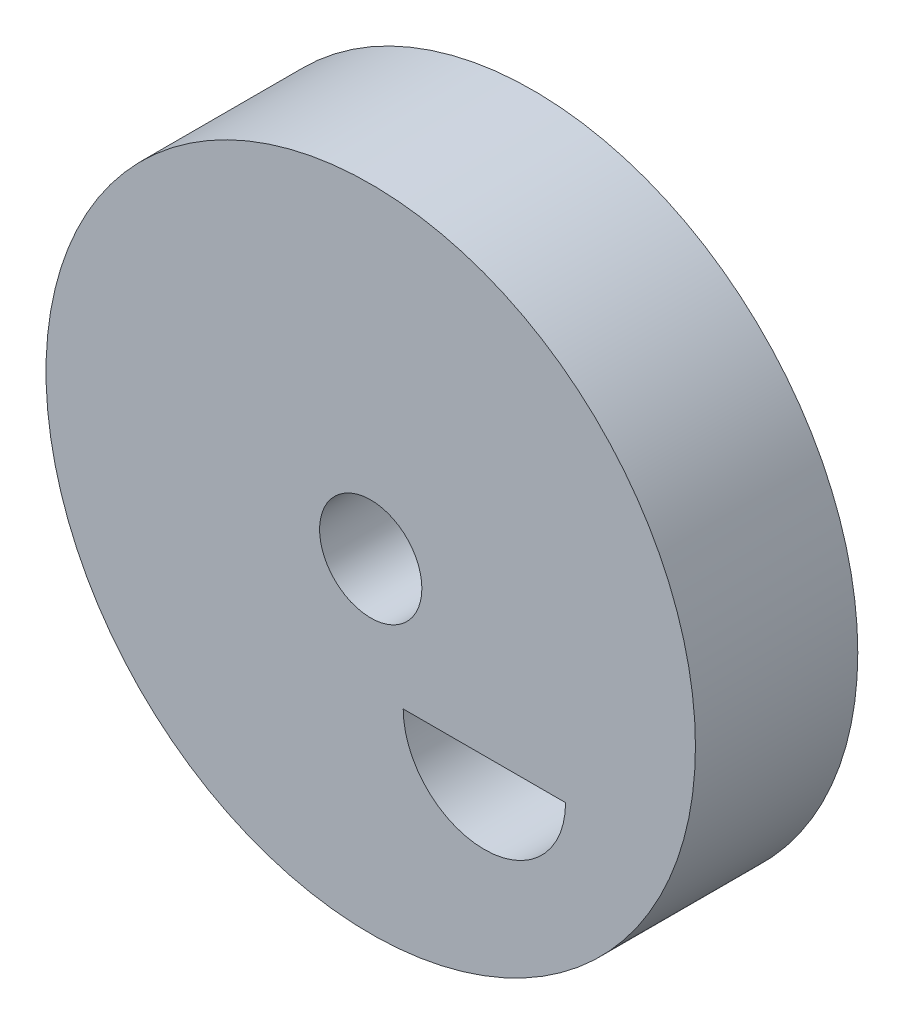
ISO-10303-21;
HEADER;
FILE_DESCRIPTION(('STEP AP214'),'2;1');
FILE_NAME('part.step','',(''),(''),'','','');
FILE_SCHEMA(('AUTOMOTIVE_DESIGN { 1 0 10303 214 1 1 1 1 }'));
ENDSEC;
DATA;
#1=APPLICATION_CONTEXT('core data for automotive mechanical design processes');
#2=APPLICATION_PROTOCOL_DEFINITION('international standard','automotive_design',2000,#1);
#3=PRODUCT_CONTEXT('',#1,'mechanical');
#4=PRODUCT('Part','Part','',(#3));
#5=PRODUCT_RELATED_PRODUCT_CATEGORY('part','',(#4));
#6=PRODUCT_DEFINITION_FORMATION('','',#4);
#7=PRODUCT_DEFINITION_CONTEXT('part definition',#1,'design');
#8=PRODUCT_DEFINITION('design','',#6,#7);
#9=PRODUCT_DEFINITION_SHAPE('','',#8);
#10=(LENGTH_UNIT() NAMED_UNIT(*) SI_UNIT(.MILLI.,.METRE.));
#11=(NAMED_UNIT(*) PLANE_ANGLE_UNIT() SI_UNIT($,.RADIAN.));
#12=(NAMED_UNIT(*) SI_UNIT($,.STERADIAN.) SOLID_ANGLE_UNIT());
#13=UNCERTAINTY_MEASURE_WITH_UNIT(LENGTH_MEASURE(1.E-05),#10,'distance_accuracy_value','');
#14=(GEOMETRIC_REPRESENTATION_CONTEXT(3) GLOBAL_UNCERTAINTY_ASSIGNED_CONTEXT((#13)) GLOBAL_UNIT_ASSIGNED_CONTEXT((#10,
#11,#12)) REPRESENTATION_CONTEXT('',''));
#15=CARTESIAN_POINT('',(0.,0.,0.));
#16=DIRECTION('',(0.,0.,1.));
#17=DIRECTION('',(1.,0.,0.));
#18=AXIS2_PLACEMENT_3D('',#15,#16,#17);
#19=CARTESIAN_POINT('',(0.,0.,12.7));
#20=DIRECTION('',(0.,0.,1.));
#21=DIRECTION('',(1.,0.,0.));
#22=AXIS2_PLACEMENT_3D('',#19,#20,#21);
#23=PLANE('',#22);
#24=CARTESIAN_POINT('',(0.,0.,12.7));
#25=DIRECTION('',(0.,0.,1.));
#26=DIRECTION('',(1.,0.,0.));
#27=AXIS2_PLACEMENT_3D('',#24,#25,#26);
#28=CIRCLE('',#27,25.4);
#29=CARTESIAN_POINT('',(25.4,0.,12.7));
#30=VERTEX_POINT('',#29);
#31=EDGE_CURVE('E52',#30,#30,#28,.T.);
#32=ORIENTED_EDGE('',*,*,#31,.T.);
#33=EDGE_LOOP('',(#32));
#34=FACE_BOUND('',#33,.T.);
#35=CARTESIAN_POINT('',(0.,0.,12.7));
#36=DIRECTION('',(0.,0.,1.));
#37=DIRECTION('',(1.,0.,0.));
#38=AXIS2_PLACEMENT_3D('',#35,#36,#37);
#39=CIRCLE('',#38,4.0000047);
#40=CARTESIAN_POINT('',(4.0000047,0.,12.7));
#41=VERTEX_POINT('',#40);
#42=EDGE_CURVE('E95',#41,#41,#39,.T.);
#43=ORIENTED_EDGE('',*,*,#42,.F.);
#44=EDGE_LOOP('',(#43));
#45=FACE_BOUND('',#44,.T.);
#46=DIRECTION('',(-1.,0.,0.));
#47=VECTOR('',#46,1.);
#48=CARTESIAN_POINT('',(2.54,-8.89,12.7));
#49=LINE('',#48,#47);
#50=CARTESIAN_POINT('',(15.24,-8.89,12.7));
#51=VERTEX_POINT('',#50);
#52=CARTESIAN_POINT('',(2.54,-8.89,12.7));
#53=VERTEX_POINT('',#52);
#54=EDGE_CURVE('E78',#51,#53,#49,.T.);
#55=ORIENTED_EDGE('',*,*,#54,.F.);
#56=CARTESIAN_POINT('',(8.89,-8.89,12.7));
#57=DIRECTION('',(0.,0.,1.));
#58=DIRECTION('',(1.,0.,0.));
#59=AXIS2_PLACEMENT_3D('',#56,#57,#58);
#60=CIRCLE('',#59,6.35);
#61=EDGE_CURVE('E59',#53,#51,#60,.T.);
#62=ORIENTED_EDGE('',*,*,#61,.F.);
#63=EDGE_LOOP('',(#55,#62));
#64=FACE_BOUND('',#63,.T.);
#65=ADVANCED_FACE('F43',(#34,#45,#64),#23,.T.);
#66=CARTESIAN_POINT('',(8.89,-8.89,6.35));
#67=DIRECTION('',(0.,0.,1.));
#68=DIRECTION('',(1.,0.,0.));
#69=AXIS2_PLACEMENT_3D('',#66,#67,#68);
#70=PLANE('',#69);
#71=DIRECTION('',(1.,0.,0.));
#72=VECTOR('',#71,1.);
#73=CARTESIAN_POINT('',(8.89,-8.89,6.35));
#74=LINE('',#73,#72);
#75=CARTESIAN_POINT('',(2.54,-8.89,6.35));
#76=VERTEX_POINT('',#75);
#77=CARTESIAN_POINT('',(15.24,-8.89,6.35));
#78=VERTEX_POINT('',#77);
#79=EDGE_CURVE('E11',#76,#78,#74,.T.);
#80=ORIENTED_EDGE('',*,*,#79,.F.);
#81=CARTESIAN_POINT('',(8.89,-8.89,6.35));
#82=DIRECTION('',(0.,0.,1.));
#83=DIRECTION('',(1.,0.,0.));
#84=AXIS2_PLACEMENT_3D('',#81,#82,#83);
#85=CIRCLE('',#84,6.35);
#86=EDGE_CURVE('E73',#78,#76,#85,.T.);
#87=ORIENTED_EDGE('',*,*,#86,.F.);
#88=EDGE_LOOP('',(#80,#87));
#89=FACE_BOUND('',#88,.T.);
#90=ADVANCED_FACE('F113',(#89),#70,.F.);
#91=CARTESIAN_POINT('',(0.,0.,0.));
#92=DIRECTION('',(0.,0.,1.));
#93=DIRECTION('',(1.,0.,0.));
#94=AXIS2_PLACEMENT_3D('',#91,#92,#93);
#95=PLANE('',#94);
#96=CARTESIAN_POINT('',(8.89,-8.89,0.));
#97=DIRECTION('',(0.,0.,1.));
#98=DIRECTION('',(1.,0.,0.));
#99=AXIS2_PLACEMENT_3D('',#96,#97,#98);
#100=CIRCLE('',#99,6.35);
#101=CARTESIAN_POINT('',(15.24,-8.89,0.));
#102=VERTEX_POINT('',#101);
#103=EDGE_CURVE('E84',#102,#102,#100,.T.);
#104=ORIENTED_EDGE('',*,*,#103,.T.);
#105=EDGE_LOOP('',(#104));
#106=FACE_BOUND('',#105,.T.);
#107=CARTESIAN_POINT('',(0.,0.,0.));
#108=DIRECTION('',(0.,0.,1.));
#109=DIRECTION('',(1.,0.,0.));
#110=AXIS2_PLACEMENT_3D('',#107,#108,#109);
#111=CIRCLE('',#110,25.4);
#112=CARTESIAN_POINT('',(25.4,0.,0.));
#113=VERTEX_POINT('',#112);
#114=EDGE_CURVE('E99',#113,#113,#111,.T.);
#115=ORIENTED_EDGE('',*,*,#114,.F.);
#116=EDGE_LOOP('',(#115));
#117=FACE_BOUND('',#116,.T.);
#118=CARTESIAN_POINT('',(0.,0.,0.));
#119=DIRECTION('',(0.,0.,1.));
#120=DIRECTION('',(1.,0.,0.));
#121=AXIS2_PLACEMENT_3D('',#118,#119,#120);
#122=CIRCLE('',#121,4.0000047);
#123=CARTESIAN_POINT('',(4.0000047,0.,0.));
#124=VERTEX_POINT('',#123);
#125=EDGE_CURVE('E93',#124,#124,#122,.T.);
#126=ORIENTED_EDGE('',*,*,#125,.T.);
#127=EDGE_LOOP('',(#126));
#128=FACE_BOUND('',#127,.T.);
#129=ADVANCED_FACE('F110',(#106,#117,#128),#95,.F.);
#130=CARTESIAN_POINT('',(0.,0.,12.7));
#131=DIRECTION('',(0.,0.,-1.));
#132=DIRECTION('',(-1.,0.,0.));
#133=AXIS2_PLACEMENT_3D('',#130,#131,#132);
#134=CYLINDRICAL_SURFACE('',#133,25.4);
#135=ORIENTED_EDGE('',*,*,#31,.F.);
#136=EDGE_LOOP('',(#135));
#137=FACE_BOUND('',#136,.T.);
#138=ORIENTED_EDGE('',*,*,#114,.T.);
#139=EDGE_LOOP('',(#138));
#140=FACE_BOUND('',#139,.T.);
#141=ADVANCED_FACE('F45',(#137,#140),#134,.T.);
#142=CARTESIAN_POINT('',(0.,0.,12.7));
#143=DIRECTION('',(0.,0.,-1.));
#144=DIRECTION('',(-1.,0.,0.));
#145=AXIS2_PLACEMENT_3D('',#142,#143,#144);
#146=CYLINDRICAL_SURFACE('',#145,4.0000047);
#147=ORIENTED_EDGE('',*,*,#42,.T.);
#148=EDGE_LOOP('',(#147));
#149=FACE_BOUND('',#148,.T.);
#150=ORIENTED_EDGE('',*,*,#125,.F.);
#151=EDGE_LOOP('',(#150));
#152=FACE_BOUND('',#151,.T.);
#153=ADVANCED_FACE('F117',(#149,#152),#146,.F.);
#154=CARTESIAN_POINT('',(8.89,-8.89,6.35));
#155=DIRECTION('',(0.,0.,-1.));
#156=DIRECTION('',(-1.,0.,0.));
#157=AXIS2_PLACEMENT_3D('',#154,#155,#156);
#158=CYLINDRICAL_SURFACE('',#157,6.35);
#159=ORIENTED_EDGE('',*,*,#103,.F.);
#160=EDGE_LOOP('',(#159));
#161=FACE_BOUND('',#160,.T.);
#162=ORIENTED_EDGE('',*,*,#86,.T.);
#163=DIRECTION('',(0.,0.,-1.));
#164=VECTOR('',#163,1.);
#165=CARTESIAN_POINT('',(2.54,-8.89,26.8990316571237));
#166=LINE('',#165,#164);
#167=EDGE_CURVE('E65',#53,#76,#166,.T.);
#168=ORIENTED_EDGE('',*,*,#167,.F.);
#169=ORIENTED_EDGE('',*,*,#61,.T.);
#170=DIRECTION('',(0.,0.,-1.));
#171=VECTOR('',#170,1.);
#172=CARTESIAN_POINT('',(15.24,-8.89,26.8990316571237));
#173=LINE('',#172,#171);
#174=EDGE_CURVE('E75',#51,#78,#173,.T.);
#175=ORIENTED_EDGE('',*,*,#174,.T.);
#176=EDGE_LOOP('',(#162,#168,#169,#175));
#177=FACE_BOUND('',#176,.T.);
#178=ADVANCED_FACE('F71',(#161,#177),#158,.F.);
#179=CARTESIAN_POINT('',(2.54,-8.89,26.8990316571237));
#180=DIRECTION('',(0.,-1.,0.));
#181=DIRECTION('',(0.,0.,-1.));
#182=AXIS2_PLACEMENT_3D('',#179,#180,#181);
#183=PLANE('',#182);
#184=ORIENTED_EDGE('',*,*,#79,.T.);
#185=ORIENTED_EDGE('',*,*,#174,.F.);
#186=ORIENTED_EDGE('',*,*,#54,.T.);
#187=ORIENTED_EDGE('',*,*,#167,.T.);
#188=EDGE_LOOP('',(#184,#185,#186,#187));
#189=FACE_BOUND('',#188,.T.);
#190=ADVANCED_FACE('F79',(#189),#183,.T.);
#191=CLOSED_SHELL('',(#65,#90,#129,#141,#153,#178,#190));
#192=MANIFOLD_SOLID_BREP('B2',#191);
#193=ADVANCED_BREP_SHAPE_REPRESENTATION('',(#18,#192),#14);
#194=SHAPE_DEFINITION_REPRESENTATION(#9,#193);
ENDSEC;
END-ISO-10303-21;
